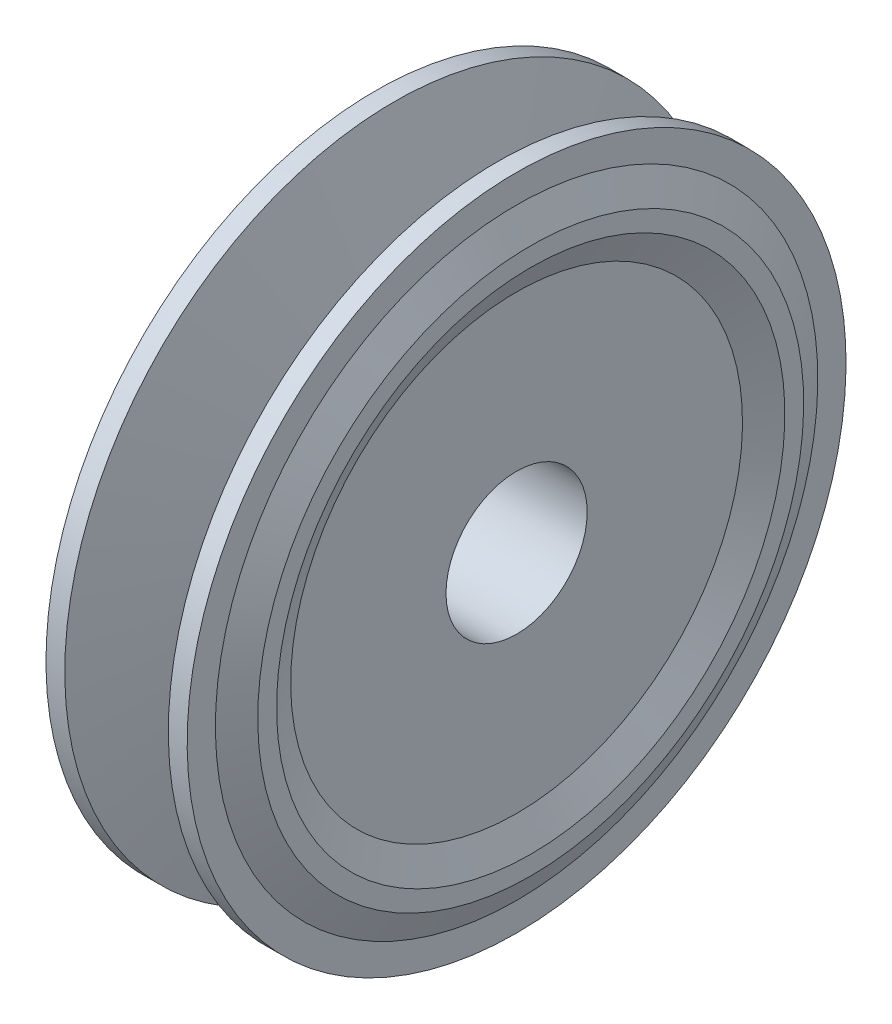
ISO-10303-21;
HEADER;
FILE_DESCRIPTION(('STEP AP214'),'2;1');
FILE_NAME('part.step','',(''),(''),'','','');
FILE_SCHEMA(('AUTOMOTIVE_DESIGN { 1 0 10303 214 1 1 1 1 }'));
ENDSEC;
DATA;
#1=APPLICATION_CONTEXT('core data for automotive mechanical design processes');
#2=APPLICATION_PROTOCOL_DEFINITION('international standard','automotive_design',2000,#1);
#3=PRODUCT_CONTEXT('',#1,'mechanical');
#4=PRODUCT('Part','Part','',(#3));
#5=PRODUCT_RELATED_PRODUCT_CATEGORY('part','',(#4));
#6=PRODUCT_DEFINITION_FORMATION('','',#4);
#7=PRODUCT_DEFINITION_CONTEXT('part definition',#1,'design');
#8=PRODUCT_DEFINITION('design','',#6,#7);
#9=PRODUCT_DEFINITION_SHAPE('','',#8);
#10=(LENGTH_UNIT() NAMED_UNIT(*) SI_UNIT(.MILLI.,.METRE.));
#11=(NAMED_UNIT(*) PLANE_ANGLE_UNIT() SI_UNIT($,.RADIAN.));
#12=(NAMED_UNIT(*) SI_UNIT($,.STERADIAN.) SOLID_ANGLE_UNIT());
#13=UNCERTAINTY_MEASURE_WITH_UNIT(LENGTH_MEASURE(1.E-05),#10,'distance_accuracy_value','');
#14=(GEOMETRIC_REPRESENTATION_CONTEXT(3) GLOBAL_UNCERTAINTY_ASSIGNED_CONTEXT((#13)) GLOBAL_UNIT_ASSIGNED_CONTEXT((#10,
#11,#12)) REPRESENTATION_CONTEXT('',''));
#15=CARTESIAN_POINT('',(0.,0.,0.));
#16=DIRECTION('',(0.,0.,1.));
#17=DIRECTION('',(1.,0.,0.));
#18=AXIS2_PLACEMENT_3D('',#15,#16,#17);
#19=CARTESIAN_POINT('',(9.,29.,0.));
#20=DIRECTION('',(-1.,0.,0.));
#21=DIRECTION('',(0.,-1.,0.));
#22=AXIS2_PLACEMENT_3D('',#19,#20,#21);
#23=PLANE('',#22);
#24=CARTESIAN_POINT('',(9.,0.,0.));
#25=DIRECTION('',(-1.,0.,0.));
#26=DIRECTION('',(0.,-1.,0.));
#27=AXIS2_PLACEMENT_3D('',#24,#25,#26);
#28=CIRCLE('',#27,29.);
#29=CARTESIAN_POINT('',(9.00000000000001,-29.,0.));
#30=VERTEX_POINT('',#29);
#31=EDGE_CURVE('E10',#30,#30,#28,.T.);
#32=ORIENTED_EDGE('',*,*,#31,.F.);
#33=EDGE_LOOP('',(#32));
#34=FACE_BOUND('',#33,.T.);
#35=CARTESIAN_POINT('',(9.,0.,0.));
#36=DIRECTION('',(-1.,0.,0.));
#37=DIRECTION('',(0.,-1.,0.));
#38=AXIS2_PLACEMENT_3D('',#35,#36,#37);
#39=CIRCLE('',#38,26.9993523124785);
#40=CARTESIAN_POINT('',(9.00000000000001,-26.9993523124785,0.));
#41=VERTEX_POINT('',#40);
#42=EDGE_CURVE('E79',#41,#41,#39,.T.);
#43=ORIENTED_EDGE('',*,*,#42,.T.);
#44=EDGE_LOOP('',(#43));
#45=FACE_BOUND('',#44,.T.);
#46=ADVANCED_FACE('F33',(#34,#45),#23,.F.);
#47=CARTESIAN_POINT('',(9.,0.,0.));
#48=DIRECTION('',(-1.,0.,0.));
#49=DIRECTION('',(0.,-1.,0.));
#50=AXIS2_PLACEMENT_3D('',#47,#48,#49);
#51=CONICAL_SURFACE('',#50,29.,1.10714871779409);
#52=CARTESIAN_POINT('',(7.5,0.,0.));
#53=DIRECTION('',(-1.,0.,0.));
#54=DIRECTION('',(0.,-1.,0.));
#55=AXIS2_PLACEMENT_3D('',#52,#53,#54);
#56=CIRCLE('',#55,32.);
#57=CARTESIAN_POINT('',(7.50000000000001,-32.,0.));
#58=VERTEX_POINT('',#57);
#59=EDGE_CURVE('E40',#58,#58,#56,.T.);
#60=ORIENTED_EDGE('',*,*,#59,.F.);
#61=EDGE_LOOP('',(#60));
#62=FACE_BOUND('',#61,.T.);
#63=ORIENTED_EDGE('',*,*,#31,.T.);
#64=EDGE_LOOP('',(#63));
#65=FACE_BOUND('',#64,.T.);
#66=ADVANCED_FACE('F103',(#62,#65),#51,.T.);
#67=CARTESIAN_POINT('',(7.5,35.,0.));
#68=DIRECTION('',(-1.,0.,0.));
#69=DIRECTION('',(0.,-1.,0.));
#70=AXIS2_PLACEMENT_3D('',#67,#68,#69);
#71=PLANE('',#70);
#72=CARTESIAN_POINT('',(7.5,0.,0.));
#73=DIRECTION('',(-1.,0.,0.));
#74=DIRECTION('',(0.,-1.,0.));
#75=AXIS2_PLACEMENT_3D('',#72,#73,#74);
#76=CIRCLE('',#75,35.);
#77=CARTESIAN_POINT('',(7.50000000000001,-35.,0.));
#78=VERTEX_POINT('',#77);
#79=EDGE_CURVE('E44',#78,#78,#76,.T.);
#80=ORIENTED_EDGE('',*,*,#79,.F.);
#81=EDGE_LOOP('',(#80));
#82=FACE_BOUND('',#81,.T.);
#83=ORIENTED_EDGE('',*,*,#59,.T.);
#84=EDGE_LOOP('',(#83));
#85=FACE_BOUND('',#84,.T.);
#86=ADVANCED_FACE('F108',(#82,#85),#71,.F.);
#87=CARTESIAN_POINT('',(0.,0.,0.));
#88=DIRECTION('',(-1.,0.,0.));
#89=DIRECTION('',(0.,-1.,0.));
#90=AXIS2_PLACEMENT_3D('',#87,#88,#89);
#91=CYLINDRICAL_SURFACE('',#90,35.);
#92=CARTESIAN_POINT('',(5.5,0.,0.));
#93=DIRECTION('',(-1.,0.,0.));
#94=DIRECTION('',(0.,-1.,0.));
#95=AXIS2_PLACEMENT_3D('',#92,#93,#94);
#96=CIRCLE('',#95,35.);
#97=CARTESIAN_POINT('',(5.50000000000001,-35.,0.));
#98=VERTEX_POINT('',#97);
#99=EDGE_CURVE('E49',#98,#98,#96,.T.);
#100=ORIENTED_EDGE('',*,*,#99,.F.);
#101=EDGE_LOOP('',(#100));
#102=FACE_BOUND('',#101,.T.);
#103=ORIENTED_EDGE('',*,*,#79,.T.);
#104=EDGE_LOOP('',(#103));
#105=FACE_BOUND('',#104,.T.);
#106=ADVANCED_FACE('F153',(#102,#105),#91,.T.);
#107=CARTESIAN_POINT('',(5.5,0.,0.));
#108=DIRECTION('',(1.,0.,0.));
#109=DIRECTION('',(0.,1.,0.));
#110=AXIS2_PLACEMENT_3D('',#107,#108,#109);
#111=CONICAL_SURFACE('',#110,35.,1.35368501205999);
#112=CARTESIAN_POINT('',(1.75,0.,0.));
#113=DIRECTION('',(-1.,0.,0.));
#114=DIRECTION('',(0.,-1.,0.));
#115=AXIS2_PLACEMENT_3D('',#112,#113,#114);
#116=CIRCLE('',#115,18.);
#117=CARTESIAN_POINT('',(1.75000000000001,-18.,0.));
#118=VERTEX_POINT('',#117);
#119=EDGE_CURVE('E52',#118,#118,#116,.T.);
#120=ORIENTED_EDGE('',*,*,#119,.F.);
#121=EDGE_LOOP('',(#120));
#122=FACE_BOUND('',#121,.T.);
#123=ORIENTED_EDGE('',*,*,#99,.T.);
#124=EDGE_LOOP('',(#123));
#125=FACE_BOUND('',#124,.T.);
#126=ADVANCED_FACE('F149',(#122,#125),#111,.T.);
#127=CARTESIAN_POINT('',(0.,0.,0.));
#128=DIRECTION('',(-1.,0.,0.));
#129=DIRECTION('',(0.,-1.,0.));
#130=AXIS2_PLACEMENT_3D('',#127,#128,#129);
#131=CYLINDRICAL_SURFACE('',#130,18.);
#132=CARTESIAN_POINT('',(-1.75,0.,0.));
#133=DIRECTION('',(-1.,0.,0.));
#134=DIRECTION('',(0.,-1.,0.));
#135=AXIS2_PLACEMENT_3D('',#132,#133,#134);
#136=CIRCLE('',#135,18.);
#137=CARTESIAN_POINT('',(-1.74999999999999,-18.,0.));
#138=VERTEX_POINT('',#137);
#139=EDGE_CURVE('E55',#138,#138,#136,.T.);
#140=ORIENTED_EDGE('',*,*,#139,.F.);
#141=EDGE_LOOP('',(#140));
#142=FACE_BOUND('',#141,.T.);
#143=ORIENTED_EDGE('',*,*,#119,.T.);
#144=EDGE_LOOP('',(#143));
#145=FACE_BOUND('',#144,.T.);
#146=ADVANCED_FACE('F145',(#142,#145),#131,.T.);
#147=CARTESIAN_POINT('',(-1.75,0.,0.));
#148=DIRECTION('',(-1.,0.,0.));
#149=DIRECTION('',(0.,-1.,0.));
#150=AXIS2_PLACEMENT_3D('',#147,#148,#149);
#151=CONICAL_SURFACE('',#150,18.,1.35368501205999);
#152=CARTESIAN_POINT('',(-5.5,0.,0.));
#153=DIRECTION('',(-1.,0.,0.));
#154=DIRECTION('',(0.,-1.,0.));
#155=AXIS2_PLACEMENT_3D('',#152,#153,#154);
#156=CIRCLE('',#155,35.);
#157=CARTESIAN_POINT('',(-5.49999999999999,-35.,0.));
#158=VERTEX_POINT('',#157);
#159=EDGE_CURVE('E58',#158,#158,#156,.T.);
#160=ORIENTED_EDGE('',*,*,#159,.F.);
#161=EDGE_LOOP('',(#160));
#162=FACE_BOUND('',#161,.T.);
#163=ORIENTED_EDGE('',*,*,#139,.T.);
#164=EDGE_LOOP('',(#163));
#165=FACE_BOUND('',#164,.T.);
#166=ADVANCED_FACE('F141',(#162,#165),#151,.T.);
#167=CARTESIAN_POINT('',(0.,0.,0.));
#168=DIRECTION('',(-1.,0.,0.));
#169=DIRECTION('',(0.,-1.,0.));
#170=AXIS2_PLACEMENT_3D('',#167,#168,#169);
#171=CYLINDRICAL_SURFACE('',#170,35.);
#172=CARTESIAN_POINT('',(-7.5,0.,0.));
#173=DIRECTION('',(-1.,0.,0.));
#174=DIRECTION('',(0.,-1.,0.));
#175=AXIS2_PLACEMENT_3D('',#172,#173,#174);
#176=CIRCLE('',#175,35.);
#177=CARTESIAN_POINT('',(-7.49999999999999,-35.,0.));
#178=VERTEX_POINT('',#177);
#179=EDGE_CURVE('E61',#178,#178,#176,.T.);
#180=ORIENTED_EDGE('',*,*,#179,.F.);
#181=EDGE_LOOP('',(#180));
#182=FACE_BOUND('',#181,.T.);
#183=ORIENTED_EDGE('',*,*,#159,.T.);
#184=EDGE_LOOP('',(#183));
#185=FACE_BOUND('',#184,.T.);
#186=ADVANCED_FACE('F137',(#182,#185),#171,.T.);
#187=CARTESIAN_POINT('',(-7.5,35.,0.));
#188=DIRECTION('',(1.,0.,0.));
#189=DIRECTION('',(0.,1.,0.));
#190=AXIS2_PLACEMENT_3D('',#187,#188,#189);
#191=PLANE('',#190);
#192=CARTESIAN_POINT('',(-7.5,0.,0.));
#193=DIRECTION('',(-1.,0.,0.));
#194=DIRECTION('',(0.,-1.,0.));
#195=AXIS2_PLACEMENT_3D('',#192,#193,#194);
#196=CIRCLE('',#195,32.);
#197=CARTESIAN_POINT('',(-7.49999999999999,-32.,0.));
#198=VERTEX_POINT('',#197);
#199=EDGE_CURVE('E64',#198,#198,#196,.T.);
#200=ORIENTED_EDGE('',*,*,#199,.F.);
#201=EDGE_LOOP('',(#200));
#202=FACE_BOUND('',#201,.T.);
#203=ORIENTED_EDGE('',*,*,#179,.T.);
#204=EDGE_LOOP('',(#203));
#205=FACE_BOUND('',#204,.T.);
#206=ADVANCED_FACE('F133',(#202,#205),#191,.F.);
#207=CARTESIAN_POINT('',(-7.5,0.,0.));
#208=DIRECTION('',(1.,0.,0.));
#209=DIRECTION('',(0.,1.,0.));
#210=AXIS2_PLACEMENT_3D('',#207,#208,#209);
#211=CONICAL_SURFACE('',#210,32.,1.10714871779409);
#212=CARTESIAN_POINT('',(-9.00000000000001,0.,0.));
#213=DIRECTION('',(-1.,0.,0.));
#214=DIRECTION('',(0.,-1.,0.));
#215=AXIS2_PLACEMENT_3D('',#212,#213,#214);
#216=CIRCLE('',#215,29.);
#217=CARTESIAN_POINT('',(-9.,-29.,0.));
#218=VERTEX_POINT('',#217);
#219=EDGE_CURVE('E67',#218,#218,#216,.T.);
#220=ORIENTED_EDGE('',*,*,#219,.F.);
#221=EDGE_LOOP('',(#220));
#222=FACE_BOUND('',#221,.T.);
#223=ORIENTED_EDGE('',*,*,#199,.T.);
#224=EDGE_LOOP('',(#223));
#225=FACE_BOUND('',#224,.T.);
#226=ADVANCED_FACE('F129',(#222,#225),#211,.T.);
#227=CARTESIAN_POINT('',(-9.00000000000001,29.,0.));
#228=DIRECTION('',(1.,0.,0.));
#229=DIRECTION('',(0.,1.,0.));
#230=AXIS2_PLACEMENT_3D('',#227,#228,#229);
#231=PLANE('',#230);
#232=CARTESIAN_POINT('',(-9.,0.,0.));
#233=DIRECTION('',(-1.,0.,0.));
#234=DIRECTION('',(0.,-1.,0.));
#235=AXIS2_PLACEMENT_3D('',#232,#233,#234);
#236=CIRCLE('',#235,26.9993523124785);
#237=CARTESIAN_POINT('',(-8.99999999999999,-26.9993523124785,0.));
#238=VERTEX_POINT('',#237);
#239=EDGE_CURVE('E70',#238,#238,#236,.T.);
#240=ORIENTED_EDGE('',*,*,#239,.F.);
#241=EDGE_LOOP('',(#240));
#242=FACE_BOUND('',#241,.T.);
#243=ORIENTED_EDGE('',*,*,#219,.T.);
#244=EDGE_LOOP('',(#243));
#245=FACE_BOUND('',#244,.T.);
#246=ADVANCED_FACE('F125',(#242,#245),#231,.F.);
#247=CARTESIAN_POINT('',(-9.,0.,0.));
#248=DIRECTION('',(-1.,0.,0.));
#249=DIRECTION('',(0.,-1.,0.));
#250=AXIS2_PLACEMENT_3D('',#247,#248,#249);
#251=CONICAL_SURFACE('',#250,26.9993523124785,1.10706234454);
#252=CARTESIAN_POINT('',(-7.5,0.,0.));
#253=DIRECTION('',(-1.,0.,0.));
#254=DIRECTION('',(0.,-1.,0.));
#255=AXIS2_PLACEMENT_3D('',#252,#253,#254);
#256=CIRCLE('',#255,24.);
#257=CARTESIAN_POINT('',(-7.5,-24.,0.));
#258=VERTEX_POINT('',#257);
#259=EDGE_CURVE('E73',#258,#258,#256,.T.);
#260=ORIENTED_EDGE('',*,*,#259,.F.);
#261=EDGE_LOOP('',(#260));
#262=FACE_BOUND('',#261,.T.);
#263=ORIENTED_EDGE('',*,*,#239,.T.);
#264=EDGE_LOOP('',(#263));
#265=FACE_BOUND('',#264,.T.);
#266=ADVANCED_FACE('F120',(#262,#265),#251,.F.);
#267=CARTESIAN_POINT('',(-7.50000000000001,24.,0.));
#268=DIRECTION('',(1.,0.,0.));
#269=DIRECTION('',(0.,1.,0.));
#270=AXIS2_PLACEMENT_3D('',#267,#268,#269);
#271=PLANE('',#270);
#272=CARTESIAN_POINT('',(-7.5,0.,0.));
#273=DIRECTION('',(1.,0.,0.));
#274=DIRECTION('',(0.,1.,0.));
#275=AXIS2_PLACEMENT_3D('',#272,#273,#274);
#276=CIRCLE('',#275,7.5);
#277=CARTESIAN_POINT('',(-7.50000000000001,7.5,0.));
#278=VERTEX_POINT('',#277);
#279=EDGE_CURVE('E82',#278,#278,#276,.T.);
#280=ORIENTED_EDGE('',*,*,#279,.T.);
#281=EDGE_LOOP('',(#280));
#282=FACE_BOUND('',#281,.T.);
#283=ORIENTED_EDGE('',*,*,#259,.T.);
#284=EDGE_LOOP('',(#283));
#285=FACE_BOUND('',#284,.T.);
#286=ADVANCED_FACE('F115',(#282,#285),#271,.F.);
#287=CARTESIAN_POINT('',(7.49999999999999,24.,0.));
#288=DIRECTION('',(-1.,0.,0.));
#289=DIRECTION('',(0.,-1.,0.));
#290=AXIS2_PLACEMENT_3D('',#287,#288,#289);
#291=PLANE('',#290);
#292=CARTESIAN_POINT('',(7.5,0.,0.));
#293=DIRECTION('',(-1.,0.,0.));
#294=DIRECTION('',(0.,-1.,0.));
#295=AXIS2_PLACEMENT_3D('',#292,#293,#294);
#296=CIRCLE('',#295,7.5);
#297=CARTESIAN_POINT('',(7.5,-7.5,0.));
#298=VERTEX_POINT('',#297);
#299=EDGE_CURVE('E36',#298,#298,#296,.T.);
#300=ORIENTED_EDGE('',*,*,#299,.T.);
#301=EDGE_LOOP('',(#300));
#302=FACE_BOUND('',#301,.T.);
#303=CARTESIAN_POINT('',(7.5,0.,0.));
#304=DIRECTION('',(-1.,0.,0.));
#305=DIRECTION('',(0.,-1.,0.));
#306=AXIS2_PLACEMENT_3D('',#303,#304,#305);
#307=CIRCLE('',#306,24.);
#308=CARTESIAN_POINT('',(7.5,-24.,0.));
#309=VERTEX_POINT('',#308);
#310=EDGE_CURVE('E76',#309,#309,#307,.T.);
#311=ORIENTED_EDGE('',*,*,#310,.F.);
#312=EDGE_LOOP('',(#311));
#313=FACE_BOUND('',#312,.T.);
#314=ADVANCED_FACE('F89',(#302,#313),#291,.F.);
#315=CARTESIAN_POINT('',(7.5,0.,0.));
#316=DIRECTION('',(1.,0.,0.));
#317=DIRECTION('',(0.,1.,0.));
#318=AXIS2_PLACEMENT_3D('',#315,#316,#317);
#319=CONICAL_SURFACE('',#318,24.,1.10706234454);
#320=ORIENTED_EDGE('',*,*,#42,.F.);
#321=EDGE_LOOP('',(#320));
#322=FACE_BOUND('',#321,.T.);
#323=ORIENTED_EDGE('',*,*,#310,.T.);
#324=EDGE_LOOP('',(#323));
#325=FACE_BOUND('',#324,.T.);
#326=ADVANCED_FACE('F95',(#322,#325),#319,.F.);
#327=CARTESIAN_POINT('',(-9.00000000000001,0.,0.));
#328=DIRECTION('',(1.,0.,0.));
#329=DIRECTION('',(0.,1.,0.));
#330=AXIS2_PLACEMENT_3D('',#327,#328,#329);
#331=CYLINDRICAL_SURFACE('',#330,7.5);
#332=ORIENTED_EDGE('',*,*,#299,.F.);
#333=EDGE_LOOP('',(#332));
#334=FACE_BOUND('',#333,.T.);
#335=ORIENTED_EDGE('',*,*,#279,.F.);
#336=EDGE_LOOP('',(#335));
#337=FACE_BOUND('',#336,.T.);
#338=ADVANCED_FACE('F92',(#334,#337),#331,.F.);
#339=CLOSED_SHELL('',(#46,#66,#86,#106,#126,#146,#166,#186,#206,#226,#246,#266,#286,#314,#326,#338));
#340=MANIFOLD_SOLID_BREP('B2',#339);
#341=ADVANCED_BREP_SHAPE_REPRESENTATION('',(#18,#340),#14);
#342=SHAPE_DEFINITION_REPRESENTATION(#9,#341);
ENDSEC;
END-ISO-10303-21;
